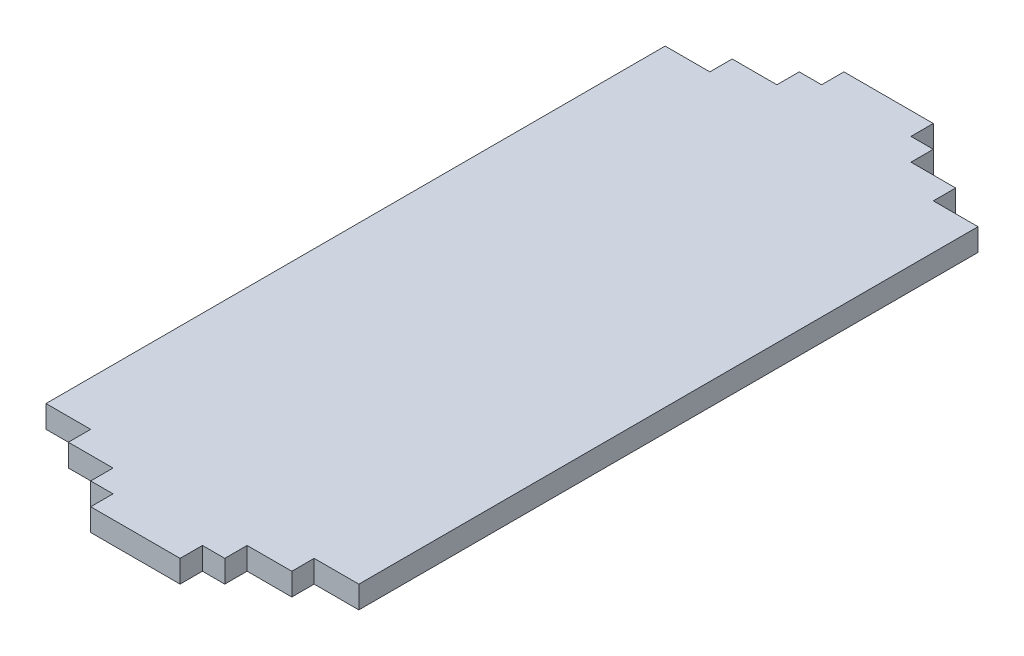
ISO-10303-21;
HEADER;
FILE_DESCRIPTION(('STEP AP214'),'2;1');
FILE_NAME('part.step','',(''),(''),'','','');
FILE_SCHEMA(('AUTOMOTIVE_DESIGN { 1 0 10303 214 1 1 1 1 }'));
ENDSEC;
DATA;
#1=APPLICATION_CONTEXT('core data for automotive mechanical design processes');
#2=APPLICATION_PROTOCOL_DEFINITION('international standard','automotive_design',2000,#1);
#3=PRODUCT_CONTEXT('',#1,'mechanical');
#4=PRODUCT('Part','Part','',(#3));
#5=PRODUCT_RELATED_PRODUCT_CATEGORY('part','',(#4));
#6=PRODUCT_DEFINITION_FORMATION('','',#4);
#7=PRODUCT_DEFINITION_CONTEXT('part definition',#1,'design');
#8=PRODUCT_DEFINITION('design','',#6,#7);
#9=PRODUCT_DEFINITION_SHAPE('','',#8);
#10=(LENGTH_UNIT() NAMED_UNIT(*) SI_UNIT(.MILLI.,.METRE.));
#11=(NAMED_UNIT(*) PLANE_ANGLE_UNIT() SI_UNIT($,.RADIAN.));
#12=(NAMED_UNIT(*) SI_UNIT($,.STERADIAN.) SOLID_ANGLE_UNIT());
#13=UNCERTAINTY_MEASURE_WITH_UNIT(LENGTH_MEASURE(1.E-05),#10,'distance_accuracy_value','');
#14=(GEOMETRIC_REPRESENTATION_CONTEXT(3) GLOBAL_UNCERTAINTY_ASSIGNED_CONTEXT((#13)) GLOBAL_UNIT_ASSIGNED_CONTEXT((#10,
#11,#12)) REPRESENTATION_CONTEXT('',''));
#15=CARTESIAN_POINT('',(0.,0.,0.));
#16=DIRECTION('',(0.,0.,1.));
#17=DIRECTION('',(1.,0.,0.));
#18=AXIS2_PLACEMENT_3D('',#15,#16,#17);
#19=CARTESIAN_POINT('',(-228.412737342942,36.0517266461979,-107.022511378717));
#20=DIRECTION('',(-1.,0.,0.));
#21=DIRECTION('',(0.,0.,1.));
#22=AXIS2_PLACEMENT_3D('',#19,#20,#21);
#23=PLANE('',#22);
#24=DIRECTION('',(0.,1.,0.));
#25=VECTOR('',#24,1.);
#26=CARTESIAN_POINT('',(-228.412737342942,32.8767266461979,-9.52500000000346));
#27=LINE('',#26,#25);
#28=CARTESIAN_POINT('',(-228.412737342942,32.8767266461979,-9.52500000000346));
#29=VERTEX_POINT('',#28);
#30=CARTESIAN_POINT('',(-228.412737342942,36.0517266461979,-9.52500000000346));
#31=VERTEX_POINT('',#30);
#32=EDGE_CURVE('E343',#29,#31,#27,.T.);
#33=ORIENTED_EDGE('',*,*,#32,.T.);
#34=DIRECTION('',(0.,0.,1.));
#35=VECTOR('',#34,1.);
#36=CARTESIAN_POINT('',(-228.412737342942,36.0517266461979,-107.022511378717));
#37=LINE('',#36,#35);
#38=CARTESIAN_POINT('',(-228.412737342942,36.0517266461979,-97.4975113786815));
#39=VERTEX_POINT('',#38);
#40=EDGE_CURVE('E11',#39,#31,#37,.T.);
#41=ORIENTED_EDGE('',*,*,#40,.F.);
#42=DIRECTION('',(0.,1.,0.));
#43=VECTOR('',#42,1.);
#44=CARTESIAN_POINT('',(-228.412737342942,32.8767266461979,-97.4975113786815));
#45=LINE('',#44,#43);
#46=CARTESIAN_POINT('',(-228.412737342942,32.8767266461979,-97.4975113786815));
#47=VERTEX_POINT('',#46);
#48=EDGE_CURVE('E262',#47,#39,#45,.T.);
#49=ORIENTED_EDGE('',*,*,#48,.F.);
#50=DIRECTION('',(0.,0.,1.));
#51=VECTOR('',#50,1.);
#52=CARTESIAN_POINT('',(-228.412737342942,32.8767266461979,-107.022511378717));
#53=LINE('',#52,#51);
#54=EDGE_CURVE('E36',#47,#29,#53,.T.);
#55=ORIENTED_EDGE('',*,*,#54,.T.);
#56=EDGE_LOOP('',(#33,#41,#49,#55));
#57=FACE_BOUND('',#56,.T.);
#58=ADVANCED_FACE('F33',(#57),#23,.T.);
#59=CARTESIAN_POINT('',(-228.412737342942,36.0517266461979,-107.022511378717));
#60=DIRECTION('',(0.,-1.,0.));
#61=DIRECTION('',(0.,0.,-1.));
#62=AXIS2_PLACEMENT_3D('',#59,#60,#61);
#63=PLANE('',#62);
#64=DIRECTION('',(1.,0.,0.));
#65=VECTOR('',#64,1.);
#66=CARTESIAN_POINT('',(-228.412737342942,36.0517266461979,0.));
#67=LINE('',#66,#65);
#68=CARTESIAN_POINT('',(-212.537737342942,36.0517266461979,0.));
#69=VERTEX_POINT('',#68);
#70=CARTESIAN_POINT('',(-199.837737342942,36.0517266461979,0.));
#71=VERTEX_POINT('',#70);
#72=EDGE_CURVE('E250',#69,#71,#67,.T.);
#73=ORIENTED_EDGE('',*,*,#72,.T.);
#74=DIRECTION('',(0.,0.,1.));
#75=VECTOR('',#74,1.);
#76=CARTESIAN_POINT('',(-199.837737342942,36.0517266461979,0.));
#77=LINE('',#76,#75);
#78=CARTESIAN_POINT('',(-199.837737342942,36.0517266461979,-3.17500000000412));
#79=VERTEX_POINT('',#78);
#80=EDGE_CURVE('E49',#79,#71,#77,.T.);
#81=ORIENTED_EDGE('',*,*,#80,.F.);
#82=DIRECTION('',(-1.,0.,0.));
#83=VECTOR('',#82,1.);
#84=CARTESIAN_POINT('',(-196.662737342942,36.0517266461979,-3.17500000000411));
#85=LINE('',#84,#83);
#86=CARTESIAN_POINT('',(-196.662737342942,36.0517266461979,-3.17500000000411));
#87=VERTEX_POINT('',#86);
#88=EDGE_CURVE('E417',#87,#79,#85,.T.);
#89=ORIENTED_EDGE('',*,*,#88,.F.);
#90=DIRECTION('',(0.,0.,1.));
#91=VECTOR('',#90,1.);
#92=CARTESIAN_POINT('',(-196.662737342942,36.0517266461979,-3.17500000000411));
#93=LINE('',#92,#91);
#94=CARTESIAN_POINT('',(-196.662737342942,36.0517266461979,-6.3500000000043));
#95=VERTEX_POINT('',#94);
#96=EDGE_CURVE('E420',#95,#87,#93,.T.);
#97=ORIENTED_EDGE('',*,*,#96,.F.);
#98=DIRECTION('',(-1.,0.,0.));
#99=VECTOR('',#98,1.);
#100=CARTESIAN_POINT('',(-190.312737342942,36.0517266461979,-6.3500000000043));
#101=LINE('',#100,#99);
#102=CARTESIAN_POINT('',(-190.312737342942,36.0517266461979,-6.3500000000043));
#103=VERTEX_POINT('',#102);
#104=EDGE_CURVE('E423',#103,#95,#101,.T.);
#105=ORIENTED_EDGE('',*,*,#104,.F.);
#106=DIRECTION('',(0.,0.,1.));
#107=VECTOR('',#106,1.);
#108=CARTESIAN_POINT('',(-190.312737342942,36.0517266461979,-6.3500000000043));
#109=LINE('',#108,#107);
#110=CARTESIAN_POINT('',(-190.312737342942,36.0517266461979,-9.52500000000126));
#111=VERTEX_POINT('',#110);
#112=EDGE_CURVE('E426',#111,#103,#109,.T.);
#113=ORIENTED_EDGE('',*,*,#112,.F.);
#114=DIRECTION('',(-1.,0.,2.87117224134114E-13));
#115=VECTOR('',#114,1.);
#116=CARTESIAN_POINT('',(-183.962737342942,36.0517266461979,-9.52500000000308));
#117=LINE('',#116,#115);
#118=CARTESIAN_POINT('',(-183.962737342942,36.0517266461979,-9.52500000000308));
#119=VERTEX_POINT('',#118);
#120=EDGE_CURVE('E429',#119,#111,#117,.T.);
#121=ORIENTED_EDGE('',*,*,#120,.F.);
#122=DIRECTION('',(0.,0.,1.));
#123=VECTOR('',#122,1.);
#124=CARTESIAN_POINT('',(-183.962737342942,36.0517266461979,-107.022511378717));
#125=LINE('',#124,#123);
#126=CARTESIAN_POINT('',(-183.962737342942,36.0517266461979,-97.4975113786815));
#127=VERTEX_POINT('',#126);
#128=EDGE_CURVE('E41',#127,#119,#125,.T.);
#129=ORIENTED_EDGE('',*,*,#128,.F.);
#130=DIRECTION('',(1.,0.,0.));
#131=VECTOR('',#130,1.);
#132=CARTESIAN_POINT('',(-183.962737342942,36.0517266461979,-97.4975113786815));
#133=LINE('',#132,#131);
#134=CARTESIAN_POINT('',(-190.312737342942,36.0517266461979,-97.4975113786815));
#135=VERTEX_POINT('',#134);
#136=EDGE_CURVE('E325',#135,#127,#133,.T.);
#137=ORIENTED_EDGE('',*,*,#136,.F.);
#138=DIRECTION('',(0.,0.,1.));
#139=VECTOR('',#138,1.);
#140=CARTESIAN_POINT('',(-190.312737342942,36.0517266461979,-100.672511378681));
#141=LINE('',#140,#139);
#142=CARTESIAN_POINT('',(-190.312737342942,36.0517266461979,-100.672511378681));
#143=VERTEX_POINT('',#142);
#144=EDGE_CURVE('E328',#143,#135,#141,.T.);
#145=ORIENTED_EDGE('',*,*,#144,.F.);
#146=DIRECTION('',(1.,0.,0.));
#147=VECTOR('',#146,1.);
#148=CARTESIAN_POINT('',(-190.312737342942,36.0517266461979,-100.672511378681));
#149=LINE('',#148,#147);
#150=CARTESIAN_POINT('',(-196.662737342942,36.0517266461979,-100.672511378681));
#151=VERTEX_POINT('',#150);
#152=EDGE_CURVE('E331',#151,#143,#149,.T.);
#153=ORIENTED_EDGE('',*,*,#152,.F.);
#154=DIRECTION('',(0.,0.,1.));
#155=VECTOR('',#154,1.);
#156=CARTESIAN_POINT('',(-196.662737342942,36.0517266461979,-103.847511378682));
#157=LINE('',#156,#155);
#158=CARTESIAN_POINT('',(-196.662737342942,36.0517266461979,-103.847511378682));
#159=VERTEX_POINT('',#158);
#160=EDGE_CURVE('E334',#159,#151,#157,.T.);
#161=ORIENTED_EDGE('',*,*,#160,.F.);
#162=DIRECTION('',(1.,0.,0.));
#163=VECTOR('',#162,1.);
#164=CARTESIAN_POINT('',(-196.662737342942,36.0517266461979,-103.847511378682));
#165=LINE('',#164,#163);
#166=CARTESIAN_POINT('',(-199.837737342942,36.0517266461979,-103.847511378682));
#167=VERTEX_POINT('',#166);
#168=EDGE_CURVE('E337',#167,#159,#165,.T.);
#169=ORIENTED_EDGE('',*,*,#168,.F.);
#170=DIRECTION('',(0.,0.,1.));
#171=VECTOR('',#170,1.);
#172=CARTESIAN_POINT('',(-199.837737342942,36.0517266461979,-107.022511378717));
#173=LINE('',#172,#171);
#174=CARTESIAN_POINT('',(-199.837737342942,36.0517266461979,-107.022511378717));
#175=VERTEX_POINT('',#174);
#176=EDGE_CURVE('E340',#175,#167,#173,.T.);
#177=ORIENTED_EDGE('',*,*,#176,.F.);
#178=DIRECTION('',(1.,0.,0.));
#179=VECTOR('',#178,1.);
#180=CARTESIAN_POINT('',(-228.412737342942,36.0517266461979,-107.022511378717));
#181=LINE('',#180,#179);
#182=CARTESIAN_POINT('',(-212.537737342942,36.0517266461979,-107.022511378717));
#183=VERTEX_POINT('',#182);
#184=EDGE_CURVE('E248',#183,#175,#181,.T.);
#185=ORIENTED_EDGE('',*,*,#184,.F.);
#186=DIRECTION('',(0.,0.,-1.));
#187=VECTOR('',#186,1.);
#188=CARTESIAN_POINT('',(-212.537737342942,36.0517266461979,-107.022511378717));
#189=LINE('',#188,#187);
#190=CARTESIAN_POINT('',(-212.537737342942,36.0517266461979,-103.847511378682));
#191=VERTEX_POINT('',#190);
#192=EDGE_CURVE('E277',#191,#183,#189,.T.);
#193=ORIENTED_EDGE('',*,*,#192,.F.);
#194=DIRECTION('',(1.,0.,0.));
#195=VECTOR('',#194,1.);
#196=CARTESIAN_POINT('',(-215.712737342942,36.0517266461979,-103.847511378682));
#197=LINE('',#196,#195);
#198=CARTESIAN_POINT('',(-215.712737342942,36.0517266461979,-103.847511378682));
#199=VERTEX_POINT('',#198);
#200=EDGE_CURVE('E280',#199,#191,#197,.T.);
#201=ORIENTED_EDGE('',*,*,#200,.F.);
#202=DIRECTION('',(0.,0.,-1.));
#203=VECTOR('',#202,1.);
#204=CARTESIAN_POINT('',(-215.712737342942,36.0517266461979,-103.847511378682));
#205=LINE('',#204,#203);
#206=CARTESIAN_POINT('',(-215.712737342942,36.0517266461979,-100.672511378681));
#207=VERTEX_POINT('',#206);
#208=EDGE_CURVE('E283',#207,#199,#205,.T.);
#209=ORIENTED_EDGE('',*,*,#208,.F.);
#210=DIRECTION('',(1.,0.,0.));
#211=VECTOR('',#210,1.);
#212=CARTESIAN_POINT('',(-222.062737342942,36.0517266461979,-100.672511378681));
#213=LINE('',#212,#211);
#214=CARTESIAN_POINT('',(-222.062737342942,36.0517266461979,-100.672511378681));
#215=VERTEX_POINT('',#214);
#216=EDGE_CURVE('E286',#215,#207,#213,.T.);
#217=ORIENTED_EDGE('',*,*,#216,.F.);
#218=DIRECTION('',(0.,0.,-1.));
#219=VECTOR('',#218,1.);
#220=CARTESIAN_POINT('',(-222.062737342942,36.0517266461979,-100.672511378681));
#221=LINE('',#220,#219);
#222=CARTESIAN_POINT('',(-222.062737342942,36.0517266461979,-97.4975113786815));
#223=VERTEX_POINT('',#222);
#224=EDGE_CURVE('E289',#223,#215,#221,.T.);
#225=ORIENTED_EDGE('',*,*,#224,.F.);
#226=DIRECTION('',(1.,0.,0.));
#227=VECTOR('',#226,1.);
#228=CARTESIAN_POINT('',(-228.412737342942,36.0517266461979,-97.4975113786815));
#229=LINE('',#228,#227);
#230=EDGE_CURVE('E292',#39,#223,#229,.T.);
#231=ORIENTED_EDGE('',*,*,#230,.F.);
#232=ORIENTED_EDGE('',*,*,#40,.T.);
#233=DIRECTION('',(-1.,0.,-3.47491064794095E-13));
#234=VECTOR('',#233,1.);
#235=CARTESIAN_POINT('',(-228.412737342942,36.0517266461979,-9.52500000000346));
#236=LINE('',#235,#234);
#237=CARTESIAN_POINT('',(-222.062737342942,36.0517266461979,-9.52500000000126));
#238=VERTEX_POINT('',#237);
#239=EDGE_CURVE('E373',#238,#31,#236,.T.);
#240=ORIENTED_EDGE('',*,*,#239,.F.);
#241=DIRECTION('',(0.,0.,-1.));
#242=VECTOR('',#241,1.);
#243=CARTESIAN_POINT('',(-222.062737342942,36.0517266461979,-6.3500000000043));
#244=LINE('',#243,#242);
#245=CARTESIAN_POINT('',(-222.062737342942,36.0517266461979,-6.3500000000043));
#246=VERTEX_POINT('',#245);
#247=EDGE_CURVE('E375',#246,#238,#244,.T.);
#248=ORIENTED_EDGE('',*,*,#247,.F.);
#249=DIRECTION('',(-1.,0.,0.));
#250=VECTOR('',#249,1.);
#251=CARTESIAN_POINT('',(-222.062737342942,36.0517266461979,-6.3500000000043));
#252=LINE('',#251,#250);
#253=CARTESIAN_POINT('',(-215.712737342942,36.0517266461979,-6.3500000000043));
#254=VERTEX_POINT('',#253);
#255=EDGE_CURVE('E378',#254,#246,#252,.T.);
#256=ORIENTED_EDGE('',*,*,#255,.F.);
#257=DIRECTION('',(0.,0.,-1.));
#258=VECTOR('',#257,1.);
#259=CARTESIAN_POINT('',(-215.712737342942,36.0517266461979,-3.17500000000411));
#260=LINE('',#259,#258);
#261=CARTESIAN_POINT('',(-215.712737342942,36.0517266461979,-3.17500000000411));
#262=VERTEX_POINT('',#261);
#263=EDGE_CURVE('E381',#262,#254,#260,.T.);
#264=ORIENTED_EDGE('',*,*,#263,.F.);
#265=DIRECTION('',(-1.,0.,0.));
#266=VECTOR('',#265,1.);
#267=CARTESIAN_POINT('',(-215.712737342942,36.0517266461979,-3.17500000000411));
#268=LINE('',#267,#266);
#269=CARTESIAN_POINT('',(-212.537737342942,36.0517266461979,-3.17500000000411));
#270=VERTEX_POINT('',#269);
#271=EDGE_CURVE('E384',#270,#262,#268,.T.);
#272=ORIENTED_EDGE('',*,*,#271,.F.);
#273=DIRECTION('',(0.,0.,-1.));
#274=VECTOR('',#273,1.);
#275=CARTESIAN_POINT('',(-212.537737342942,36.0517266461979,0.));
#276=LINE('',#275,#274);
#277=EDGE_CURVE('E387',#69,#270,#276,.T.);
#278=ORIENTED_EDGE('',*,*,#277,.F.);
#279=EDGE_LOOP('',(#73,#81,#89,#97,#105,#113,#121,#129,#137,#145,#153,#161,#169,#177,#185,#193,
#201,#209,#217,#225,#231,#232,#240,#248,#256,#264,#272,#278));
#280=FACE_BOUND('',#279,.T.);
#281=ADVANCED_FACE('F464',(#280),#63,.F.);
#282=CARTESIAN_POINT('',(-183.962737342942,36.0517266461979,-107.022511378717));
#283=DIRECTION('',(-1.,0.,0.));
#284=DIRECTION('',(0.,0.,1.));
#285=AXIS2_PLACEMENT_3D('',#282,#283,#284);
#286=PLANE('',#285);
#287=ORIENTED_EDGE('',*,*,#128,.T.);
#288=DIRECTION('',(0.,1.,0.));
#289=VECTOR('',#288,1.);
#290=CARTESIAN_POINT('',(-183.962737342942,32.8767266461979,-9.52500000000308));
#291=LINE('',#290,#289);
#292=CARTESIAN_POINT('',(-183.962737342942,32.8767266461979,-9.52500000000308));
#293=VERTEX_POINT('',#292);
#294=EDGE_CURVE('E222',#293,#119,#291,.T.);
#295=ORIENTED_EDGE('',*,*,#294,.F.);
#296=DIRECTION('',(0.,0.,1.));
#297=VECTOR('',#296,1.);
#298=CARTESIAN_POINT('',(-183.962737342942,32.8767266461979,-107.022511378717));
#299=LINE('',#298,#297);
#300=CARTESIAN_POINT('',(-183.962737342942,32.8767266461979,-97.4975113786815));
#301=VERTEX_POINT('',#300);
#302=EDGE_CURVE('E236',#301,#293,#299,.T.);
#303=ORIENTED_EDGE('',*,*,#302,.F.);
#304=DIRECTION('',(0.,1.,0.));
#305=VECTOR('',#304,1.);
#306=CARTESIAN_POINT('',(-183.962737342942,32.8767266461979,-97.4975113786815));
#307=LINE('',#306,#305);
#308=EDGE_CURVE('E295',#301,#127,#307,.T.);
#309=ORIENTED_EDGE('',*,*,#308,.T.);
#310=EDGE_LOOP('',(#287,#295,#303,#309));
#311=FACE_BOUND('',#310,.T.);
#312=ADVANCED_FACE('F234',(#311),#286,.F.);
#313=CARTESIAN_POINT('',(-228.412737342942,32.8767266461979,-107.022511378717));
#314=DIRECTION('',(0.,-1.,0.));
#315=DIRECTION('',(0.,0.,-1.));
#316=AXIS2_PLACEMENT_3D('',#313,#314,#315);
#317=PLANE('',#316);
#318=DIRECTION('',(0.,0.,1.));
#319=VECTOR('',#318,1.);
#320=CARTESIAN_POINT('',(-199.837737342942,32.8767266461979,0.));
#321=LINE('',#320,#319);
#322=CARTESIAN_POINT('',(-199.837737342942,32.8767266461979,-3.17500000000412));
#323=VERTEX_POINT('',#322);
#324=CARTESIAN_POINT('',(-199.837737342942,32.8767266461979,0.));
#325=VERTEX_POINT('',#324);
#326=EDGE_CURVE('E238',#323,#325,#321,.T.);
#327=ORIENTED_EDGE('',*,*,#326,.T.);
#328=DIRECTION('',(1.,0.,0.));
#329=VECTOR('',#328,1.);
#330=CARTESIAN_POINT('',(-228.412737342942,32.8767266461979,0.));
#331=LINE('',#330,#329);
#332=CARTESIAN_POINT('',(-212.537737342942,32.8767266461979,0.));
#333=VERTEX_POINT('',#332);
#334=EDGE_CURVE('E254',#333,#325,#331,.T.);
#335=ORIENTED_EDGE('',*,*,#334,.F.);
#336=DIRECTION('',(0.,0.,-1.));
#337=VECTOR('',#336,1.);
#338=CARTESIAN_POINT('',(-212.537737342942,32.8767266461979,0.));
#339=LINE('',#338,#337);
#340=CARTESIAN_POINT('',(-212.537737342942,32.8767266461979,-3.17500000000411));
#341=VERTEX_POINT('',#340);
#342=EDGE_CURVE('E57',#333,#341,#339,.T.);
#343=ORIENTED_EDGE('',*,*,#342,.T.);
#344=DIRECTION('',(-1.,0.,0.));
#345=VECTOR('',#344,1.);
#346=CARTESIAN_POINT('',(-215.712737342942,32.8767266461979,-3.17500000000411));
#347=LINE('',#346,#345);
#348=CARTESIAN_POINT('',(-215.712737342942,32.8767266461979,-3.17500000000411));
#349=VERTEX_POINT('',#348);
#350=EDGE_CURVE('E402',#341,#349,#347,.T.);
#351=ORIENTED_EDGE('',*,*,#350,.T.);
#352=DIRECTION('',(0.,0.,-1.));
#353=VECTOR('',#352,1.);
#354=CARTESIAN_POINT('',(-215.712737342942,32.8767266461979,-3.17500000000411));
#355=LINE('',#354,#353);
#356=CARTESIAN_POINT('',(-215.712737342942,32.8767266461979,-6.3500000000043));
#357=VERTEX_POINT('',#356);
#358=EDGE_CURVE('E399',#349,#357,#355,.T.);
#359=ORIENTED_EDGE('',*,*,#358,.T.);
#360=DIRECTION('',(-1.,0.,0.));
#361=VECTOR('',#360,1.);
#362=CARTESIAN_POINT('',(-222.062737342942,32.8767266461979,-6.3500000000043));
#363=LINE('',#362,#361);
#364=CARTESIAN_POINT('',(-222.062737342942,32.8767266461979,-6.3500000000043));
#365=VERTEX_POINT('',#364);
#366=EDGE_CURVE('E396',#357,#365,#363,.T.);
#367=ORIENTED_EDGE('',*,*,#366,.T.);
#368=DIRECTION('',(0.,0.,-1.));
#369=VECTOR('',#368,1.);
#370=CARTESIAN_POINT('',(-222.062737342942,32.8767266461979,-6.3500000000043));
#371=LINE('',#370,#369);
#372=CARTESIAN_POINT('',(-222.062737342942,32.8767266461979,-9.52500000000126));
#373=VERTEX_POINT('',#372);
#374=EDGE_CURVE('E393',#365,#373,#371,.T.);
#375=ORIENTED_EDGE('',*,*,#374,.T.);
#376=DIRECTION('',(-1.,0.,-3.47491064794095E-13));
#377=VECTOR('',#376,1.);
#378=CARTESIAN_POINT('',(-228.412737342942,32.8767266461979,-9.52500000000346));
#379=LINE('',#378,#377);
#380=EDGE_CURVE('E361',#373,#29,#379,.T.);
#381=ORIENTED_EDGE('',*,*,#380,.T.);
#382=ORIENTED_EDGE('',*,*,#54,.F.);
#383=DIRECTION('',(1.,0.,0.));
#384=VECTOR('',#383,1.);
#385=CARTESIAN_POINT('',(-228.412737342942,32.8767266461979,-97.4975113786815));
#386=LINE('',#385,#384);
#387=CARTESIAN_POINT('',(-222.062737342942,32.8767266461979,-97.4975113786815));
#388=VERTEX_POINT('',#387);
#389=EDGE_CURVE('E279',#47,#388,#386,.T.);
#390=ORIENTED_EDGE('',*,*,#389,.T.);
#391=DIRECTION('',(0.,0.,-1.));
#392=VECTOR('',#391,1.);
#393=CARTESIAN_POINT('',(-222.062737342942,32.8767266461979,-100.672511378681));
#394=LINE('',#393,#392);
#395=CARTESIAN_POINT('',(-222.062737342942,32.8767266461979,-100.672511378681));
#396=VERTEX_POINT('',#395);
#397=EDGE_CURVE('E307',#388,#396,#394,.T.);
#398=ORIENTED_EDGE('',*,*,#397,.T.);
#399=DIRECTION('',(1.,0.,0.));
#400=VECTOR('',#399,1.);
#401=CARTESIAN_POINT('',(-222.062737342942,32.8767266461979,-100.672511378681));
#402=LINE('',#401,#400);
#403=CARTESIAN_POINT('',(-215.712737342942,32.8767266461979,-100.672511378681));
#404=VERTEX_POINT('',#403);
#405=EDGE_CURVE('E304',#396,#404,#402,.T.);
#406=ORIENTED_EDGE('',*,*,#405,.T.);
#407=DIRECTION('',(0.,0.,-1.));
#408=VECTOR('',#407,1.);
#409=CARTESIAN_POINT('',(-215.712737342942,32.8767266461979,-103.847511378682));
#410=LINE('',#409,#408);
#411=CARTESIAN_POINT('',(-215.712737342942,32.8767266461979,-103.847511378682));
#412=VERTEX_POINT('',#411);
#413=EDGE_CURVE('E301',#404,#412,#410,.T.);
#414=ORIENTED_EDGE('',*,*,#413,.T.);
#415=DIRECTION('',(1.,0.,0.));
#416=VECTOR('',#415,1.);
#417=CARTESIAN_POINT('',(-215.712737342942,32.8767266461979,-103.847511378682));
#418=LINE('',#417,#416);
#419=CARTESIAN_POINT('',(-212.537737342942,32.8767266461979,-103.847511378682));
#420=VERTEX_POINT('',#419);
#421=EDGE_CURVE('E298',#412,#420,#418,.T.);
#422=ORIENTED_EDGE('',*,*,#421,.T.);
#423=DIRECTION('',(0.,0.,-1.));
#424=VECTOR('',#423,1.);
#425=CARTESIAN_POINT('',(-212.537737342942,32.8767266461979,-107.022511378717));
#426=LINE('',#425,#424);
#427=CARTESIAN_POINT('',(-212.537737342942,32.8767266461979,-107.022511378717));
#428=VERTEX_POINT('',#427);
#429=EDGE_CURVE('E265',#420,#428,#426,.T.);
#430=ORIENTED_EDGE('',*,*,#429,.T.);
#431=DIRECTION('',(1.,0.,0.));
#432=VECTOR('',#431,1.);
#433=CARTESIAN_POINT('',(-228.412737342942,32.8767266461979,-107.022511378717));
#434=LINE('',#433,#432);
#435=CARTESIAN_POINT('',(-199.837737342942,32.8767266461979,-107.022511378717));
#436=VERTEX_POINT('',#435);
#437=EDGE_CURVE('E253',#428,#436,#434,.T.);
#438=ORIENTED_EDGE('',*,*,#437,.T.);
#439=DIRECTION('',(0.,0.,1.));
#440=VECTOR('',#439,1.);
#441=CARTESIAN_POINT('',(-199.837737342942,32.8767266461979,-107.022511378717));
#442=LINE('',#441,#440);
#443=CARTESIAN_POINT('',(-199.837737342942,32.8767266461979,-103.847511378682));
#444=VERTEX_POINT('',#443);
#445=EDGE_CURVE('E327',#436,#444,#442,.T.);
#446=ORIENTED_EDGE('',*,*,#445,.T.);
#447=DIRECTION('',(1.,0.,0.));
#448=VECTOR('',#447,1.);
#449=CARTESIAN_POINT('',(-196.662737342942,32.8767266461979,-103.847511378682));
#450=LINE('',#449,#448);
#451=CARTESIAN_POINT('',(-196.662737342942,32.8767266461979,-103.847511378682));
#452=VERTEX_POINT('',#451);
#453=EDGE_CURVE('E353',#444,#452,#450,.T.);
#454=ORIENTED_EDGE('',*,*,#453,.T.);
#455=DIRECTION('',(0.,0.,1.));
#456=VECTOR('',#455,1.);
#457=CARTESIAN_POINT('',(-196.662737342942,32.8767266461979,-103.847511378682));
#458=LINE('',#457,#456);
#459=CARTESIAN_POINT('',(-196.662737342942,32.8767266461979,-100.672511378681));
#460=VERTEX_POINT('',#459);
#461=EDGE_CURVE('E350',#452,#460,#458,.T.);
#462=ORIENTED_EDGE('',*,*,#461,.T.);
#463=DIRECTION('',(1.,0.,0.));
#464=VECTOR('',#463,1.);
#465=CARTESIAN_POINT('',(-190.312737342942,32.8767266461979,-100.672511378681));
#466=LINE('',#465,#464);
#467=CARTESIAN_POINT('',(-190.312737342942,32.8767266461979,-100.672511378681));
#468=VERTEX_POINT('',#467);
#469=EDGE_CURVE('E347',#460,#468,#466,.T.);
#470=ORIENTED_EDGE('',*,*,#469,.T.);
#471=DIRECTION('',(0.,0.,1.));
#472=VECTOR('',#471,1.);
#473=CARTESIAN_POINT('',(-190.312737342942,32.8767266461979,-100.672511378681));
#474=LINE('',#473,#472);
#475=CARTESIAN_POINT('',(-190.312737342942,32.8767266461979,-97.4975113786815));
#476=VERTEX_POINT('',#475);
#477=EDGE_CURVE('E345',#468,#476,#474,.T.);
#478=ORIENTED_EDGE('',*,*,#477,.T.);
#479=DIRECTION('',(1.,0.,0.));
#480=VECTOR('',#479,1.);
#481=CARTESIAN_POINT('',(-183.962737342942,32.8767266461979,-97.4975113786815));
#482=LINE('',#481,#480);
#483=EDGE_CURVE('E245',#476,#301,#482,.T.);
#484=ORIENTED_EDGE('',*,*,#483,.T.);
#485=ORIENTED_EDGE('',*,*,#302,.T.);
#486=DIRECTION('',(-1.,0.,2.87117224134114E-13));
#487=VECTOR('',#486,1.);
#488=CARTESIAN_POINT('',(-183.962737342942,32.8767266461979,-9.52500000000308));
#489=LINE('',#488,#487);
#490=CARTESIAN_POINT('',(-190.312737342942,32.8767266461979,-9.52500000000126));
#491=VERTEX_POINT('',#490);
#492=EDGE_CURVE('E218',#293,#491,#489,.T.);
#493=ORIENTED_EDGE('',*,*,#492,.T.);
#494=DIRECTION('',(0.,0.,1.));
#495=VECTOR('',#494,1.);
#496=CARTESIAN_POINT('',(-190.312737342942,32.8767266461979,-6.3500000000043));
#497=LINE('',#496,#495);
#498=CARTESIAN_POINT('',(-190.312737342942,32.8767266461979,-6.3500000000043));
#499=VERTEX_POINT('',#498);
#500=EDGE_CURVE('E229',#491,#499,#497,.T.);
#501=ORIENTED_EDGE('',*,*,#500,.T.);
#502=DIRECTION('',(-1.,0.,0.));
#503=VECTOR('',#502,1.);
#504=CARTESIAN_POINT('',(-190.312737342942,32.8767266461979,-6.3500000000043));
#505=LINE('',#504,#503);
#506=CARTESIAN_POINT('',(-196.662737342942,32.8767266461979,-6.3500000000043));
#507=VERTEX_POINT('',#506);
#508=EDGE_CURVE('E438',#499,#507,#505,.T.);
#509=ORIENTED_EDGE('',*,*,#508,.T.);
#510=DIRECTION('',(0.,0.,1.));
#511=VECTOR('',#510,1.);
#512=CARTESIAN_POINT('',(-196.662737342942,32.8767266461979,-3.17500000000411));
#513=LINE('',#512,#511);
#514=CARTESIAN_POINT('',(-196.662737342942,32.8767266461979,-3.17500000000411));
#515=VERTEX_POINT('',#514);
#516=EDGE_CURVE('E435',#507,#515,#513,.T.);
#517=ORIENTED_EDGE('',*,*,#516,.T.);
#518=DIRECTION('',(-1.,0.,0.));
#519=VECTOR('',#518,1.);
#520=CARTESIAN_POINT('',(-196.662737342942,32.8767266461979,-3.17500000000411));
#521=LINE('',#520,#519);
#522=EDGE_CURVE('E432',#515,#323,#521,.T.);
#523=ORIENTED_EDGE('',*,*,#522,.T.);
#524=EDGE_LOOP('',(#327,#335,#343,#351,#359,#367,#375,#381,#382,#390,#398,#406,#414,#422,#430,
#438,#446,#454,#462,#470,#478,#484,#485,#493,#501,#509,#517,#523));
#525=FACE_BOUND('',#524,.T.);
#526=ADVANCED_FACE('F242',(#525),#317,.T.);
#527=CARTESIAN_POINT('',(0.,0.,-107.022511378717));
#528=DIRECTION('',(0.,0.,1.));
#529=DIRECTION('',(1.,0.,0.));
#530=AXIS2_PLACEMENT_3D('',#527,#528,#529);
#531=PLANE('',#530);
#532=ORIENTED_EDGE('',*,*,#184,.T.);
#533=DIRECTION('',(0.,1.,0.));
#534=VECTOR('',#533,1.);
#535=CARTESIAN_POINT('',(-199.837737342942,32.8767266461979,-107.022511378717));
#536=LINE('',#535,#534);
#537=EDGE_CURVE('E312',#436,#175,#536,.T.);
#538=ORIENTED_EDGE('',*,*,#537,.F.);
#539=ORIENTED_EDGE('',*,*,#437,.F.);
#540=DIRECTION('',(0.,1.,0.));
#541=VECTOR('',#540,1.);
#542=CARTESIAN_POINT('',(-212.537737342942,32.8767266461979,-107.022511378717));
#543=LINE('',#542,#541);
#544=EDGE_CURVE('E257',#428,#183,#543,.T.);
#545=ORIENTED_EDGE('',*,*,#544,.T.);
#546=EDGE_LOOP('',(#532,#538,#539,#545));
#547=FACE_BOUND('',#546,.T.);
#548=ADVANCED_FACE('F516',(#547),#531,.F.);
#549=CARTESIAN_POINT('',(0.,0.,0.));
#550=DIRECTION('',(0.,0.,1.));
#551=DIRECTION('',(1.,0.,0.));
#552=AXIS2_PLACEMENT_3D('',#549,#550,#551);
#553=PLANE('',#552);
#554=DIRECTION('',(0.,1.,0.));
#555=VECTOR('',#554,1.);
#556=CARTESIAN_POINT('',(-199.837737342942,32.8767266461979,0.));
#557=LINE('',#556,#555);
#558=EDGE_CURVE('E390',#325,#71,#557,.T.);
#559=ORIENTED_EDGE('',*,*,#558,.T.);
#560=ORIENTED_EDGE('',*,*,#72,.F.);
#561=DIRECTION('',(0.,1.,0.));
#562=VECTOR('',#561,1.);
#563=CARTESIAN_POINT('',(-212.537737342942,32.8767266461979,0.));
#564=LINE('',#563,#562);
#565=EDGE_CURVE('E358',#333,#69,#564,.T.);
#566=ORIENTED_EDGE('',*,*,#565,.F.);
#567=ORIENTED_EDGE('',*,*,#334,.T.);
#568=EDGE_LOOP('',(#559,#560,#566,#567));
#569=FACE_BOUND('',#568,.T.);
#570=ADVANCED_FACE('F461',(#569),#553,.T.);
#571=CARTESIAN_POINT('',(-212.537737342942,32.8767266461979,-107.022511378717));
#572=DIRECTION('',(1.,0.,0.));
#573=DIRECTION('',(0.,0.,-1.));
#574=AXIS2_PLACEMENT_3D('',#571,#572,#573);
#575=PLANE('',#574);
#576=ORIENTED_EDGE('',*,*,#192,.T.);
#577=ORIENTED_EDGE('',*,*,#544,.F.);
#578=ORIENTED_EDGE('',*,*,#429,.F.);
#579=DIRECTION('',(0.,1.,0.));
#580=VECTOR('',#579,1.);
#581=CARTESIAN_POINT('',(-212.537737342942,32.8767266461979,-103.847511378682));
#582=LINE('',#581,#580);
#583=EDGE_CURVE('E273',#420,#191,#582,.T.);
#584=ORIENTED_EDGE('',*,*,#583,.T.);
#585=EDGE_LOOP('',(#576,#577,#578,#584));
#586=FACE_BOUND('',#585,.T.);
#587=ADVANCED_FACE('F513',(#586),#575,.F.);
#588=CARTESIAN_POINT('',(-215.712737342942,32.8767266461979,-103.847511378682));
#589=DIRECTION('',(0.,0.,1.));
#590=DIRECTION('',(1.,0.,0.));
#591=AXIS2_PLACEMENT_3D('',#588,#589,#590);
#592=PLANE('',#591);
#593=ORIENTED_EDGE('',*,*,#200,.T.);
#594=ORIENTED_EDGE('',*,*,#583,.F.);
#595=ORIENTED_EDGE('',*,*,#421,.F.);
#596=DIRECTION('',(0.,1.,0.));
#597=VECTOR('',#596,1.);
#598=CARTESIAN_POINT('',(-215.712737342942,32.8767266461979,-103.847511378682));
#599=LINE('',#598,#597);
#600=EDGE_CURVE('E271',#412,#199,#599,.T.);
#601=ORIENTED_EDGE('',*,*,#600,.T.);
#602=EDGE_LOOP('',(#593,#594,#595,#601));
#603=FACE_BOUND('',#602,.T.);
#604=ADVANCED_FACE('F509',(#603),#592,.F.);
#605=CARTESIAN_POINT('',(-215.712737342942,32.8767266461979,-103.847511378682));
#606=DIRECTION('',(1.,0.,0.));
#607=DIRECTION('',(0.,0.,-1.));
#608=AXIS2_PLACEMENT_3D('',#605,#606,#607);
#609=PLANE('',#608);
#610=ORIENTED_EDGE('',*,*,#208,.T.);
#611=ORIENTED_EDGE('',*,*,#600,.F.);
#612=ORIENTED_EDGE('',*,*,#413,.F.);
#613=DIRECTION('',(0.,1.,0.));
#614=VECTOR('',#613,1.);
#615=CARTESIAN_POINT('',(-215.712737342942,32.8767266461979,-100.672511378681));
#616=LINE('',#615,#614);
#617=EDGE_CURVE('E269',#404,#207,#616,.T.);
#618=ORIENTED_EDGE('',*,*,#617,.T.);
#619=EDGE_LOOP('',(#610,#611,#612,#618));
#620=FACE_BOUND('',#619,.T.);
#621=ADVANCED_FACE('F504',(#620),#609,.F.);
#622=CARTESIAN_POINT('',(-222.062737342942,32.8767266461979,-100.672511378681));
#623=DIRECTION('',(0.,0.,1.));
#624=DIRECTION('',(1.,0.,0.));
#625=AXIS2_PLACEMENT_3D('',#622,#623,#624);
#626=PLANE('',#625);
#627=ORIENTED_EDGE('',*,*,#216,.T.);
#628=ORIENTED_EDGE('',*,*,#617,.F.);
#629=ORIENTED_EDGE('',*,*,#405,.F.);
#630=DIRECTION('',(0.,1.,0.));
#631=VECTOR('',#630,1.);
#632=CARTESIAN_POINT('',(-222.062737342942,32.8767266461979,-100.672511378681));
#633=LINE('',#632,#631);
#634=EDGE_CURVE('E267',#396,#215,#633,.T.);
#635=ORIENTED_EDGE('',*,*,#634,.T.);
#636=EDGE_LOOP('',(#627,#628,#629,#635));
#637=FACE_BOUND('',#636,.T.);
#638=ADVANCED_FACE('F500',(#637),#626,.F.);
#639=CARTESIAN_POINT('',(-222.062737342942,32.8767266461979,-100.672511378681));
#640=DIRECTION('',(1.,0.,0.));
#641=DIRECTION('',(0.,0.,-1.));
#642=AXIS2_PLACEMENT_3D('',#639,#640,#641);
#643=PLANE('',#642);
#644=ORIENTED_EDGE('',*,*,#224,.T.);
#645=ORIENTED_EDGE('',*,*,#634,.F.);
#646=ORIENTED_EDGE('',*,*,#397,.F.);
#647=DIRECTION('',(0.,1.,0.));
#648=VECTOR('',#647,1.);
#649=CARTESIAN_POINT('',(-222.062737342942,32.8767266461979,-97.4975113786815));
#650=LINE('',#649,#648);
#651=EDGE_CURVE('E264',#388,#223,#650,.T.);
#652=ORIENTED_EDGE('',*,*,#651,.T.);
#653=EDGE_LOOP('',(#644,#645,#646,#652));
#654=FACE_BOUND('',#653,.T.);
#655=ADVANCED_FACE('F498',(#654),#643,.F.);
#656=CARTESIAN_POINT('',(-228.412737342942,32.8767266461979,-97.4975113786815));
#657=DIRECTION('',(0.,0.,1.));
#658=DIRECTION('',(1.,0.,0.));
#659=AXIS2_PLACEMENT_3D('',#656,#657,#658);
#660=PLANE('',#659);
#661=ORIENTED_EDGE('',*,*,#230,.T.);
#662=ORIENTED_EDGE('',*,*,#651,.F.);
#663=ORIENTED_EDGE('',*,*,#389,.F.);
#664=ORIENTED_EDGE('',*,*,#48,.T.);
#665=EDGE_LOOP('',(#661,#662,#663,#664));
#666=FACE_BOUND('',#665,.T.);
#667=ADVANCED_FACE('F494',(#666),#660,.F.);
#668=CARTESIAN_POINT('',(-183.962737342942,32.8767266461979,-97.4975113786815));
#669=DIRECTION('',(0.,0.,1.));
#670=DIRECTION('',(1.,0.,0.));
#671=AXIS2_PLACEMENT_3D('',#668,#669,#670);
#672=PLANE('',#671);
#673=ORIENTED_EDGE('',*,*,#136,.T.);
#674=ORIENTED_EDGE('',*,*,#308,.F.);
#675=ORIENTED_EDGE('',*,*,#483,.F.);
#676=DIRECTION('',(0.,1.,0.));
#677=VECTOR('',#676,1.);
#678=CARTESIAN_POINT('',(-190.312737342942,32.8767266461979,-97.4975113786815));
#679=LINE('',#678,#677);
#680=EDGE_CURVE('E322',#476,#135,#679,.T.);
#681=ORIENTED_EDGE('',*,*,#680,.T.);
#682=EDGE_LOOP('',(#673,#674,#675,#681));
#683=FACE_BOUND('',#682,.T.);
#684=ADVANCED_FACE('F539',(#683),#672,.F.);
#685=CARTESIAN_POINT('',(-190.312737342942,32.8767266461979,-100.672511378681));
#686=DIRECTION('',(-1.,0.,0.));
#687=DIRECTION('',(0.,0.,1.));
#688=AXIS2_PLACEMENT_3D('',#685,#686,#687);
#689=PLANE('',#688);
#690=ORIENTED_EDGE('',*,*,#144,.T.);
#691=ORIENTED_EDGE('',*,*,#680,.F.);
#692=ORIENTED_EDGE('',*,*,#477,.F.);
#693=DIRECTION('',(0.,1.,0.));
#694=VECTOR('',#693,1.);
#695=CARTESIAN_POINT('',(-190.312737342942,32.8767266461979,-100.672511378681));
#696=LINE('',#695,#694);
#697=EDGE_CURVE('E320',#468,#143,#696,.T.);
#698=ORIENTED_EDGE('',*,*,#697,.T.);
#699=EDGE_LOOP('',(#690,#691,#692,#698));
#700=FACE_BOUND('',#699,.T.);
#701=ADVANCED_FACE('F535',(#700),#689,.F.);
#702=CARTESIAN_POINT('',(-190.312737342942,32.8767266461979,-100.672511378681));
#703=DIRECTION('',(0.,0.,1.));
#704=DIRECTION('',(1.,0.,0.));
#705=AXIS2_PLACEMENT_3D('',#702,#703,#704);
#706=PLANE('',#705);
#707=ORIENTED_EDGE('',*,*,#152,.T.);
#708=ORIENTED_EDGE('',*,*,#697,.F.);
#709=ORIENTED_EDGE('',*,*,#469,.F.);
#710=DIRECTION('',(0.,1.,0.));
#711=VECTOR('',#710,1.);
#712=CARTESIAN_POINT('',(-196.662737342942,32.8767266461979,-100.672511378681));
#713=LINE('',#712,#711);
#714=EDGE_CURVE('E318',#460,#151,#713,.T.);
#715=ORIENTED_EDGE('',*,*,#714,.T.);
#716=EDGE_LOOP('',(#707,#708,#709,#715));
#717=FACE_BOUND('',#716,.T.);
#718=ADVANCED_FACE('F532',(#717),#706,.F.);
#719=CARTESIAN_POINT('',(-196.662737342942,32.8767266461979,-103.847511378682));
#720=DIRECTION('',(-1.,0.,0.));
#721=DIRECTION('',(0.,0.,1.));
#722=AXIS2_PLACEMENT_3D('',#719,#720,#721);
#723=PLANE('',#722);
#724=ORIENTED_EDGE('',*,*,#160,.T.);
#725=ORIENTED_EDGE('',*,*,#714,.F.);
#726=ORIENTED_EDGE('',*,*,#461,.F.);
#727=DIRECTION('',(0.,1.,0.));
#728=VECTOR('',#727,1.);
#729=CARTESIAN_POINT('',(-196.662737342942,32.8767266461979,-103.847511378682));
#730=LINE('',#729,#728);
#731=EDGE_CURVE('E316',#452,#159,#730,.T.);
#732=ORIENTED_EDGE('',*,*,#731,.T.);
#733=EDGE_LOOP('',(#724,#725,#726,#732));
#734=FACE_BOUND('',#733,.T.);
#735=ADVANCED_FACE('F528',(#734),#723,.F.);
#736=CARTESIAN_POINT('',(-196.662737342942,32.8767266461979,-103.847511378682));
#737=DIRECTION('',(0.,0.,1.));
#738=DIRECTION('',(1.,0.,0.));
#739=AXIS2_PLACEMENT_3D('',#736,#737,#738);
#740=PLANE('',#739);
#741=ORIENTED_EDGE('',*,*,#168,.T.);
#742=ORIENTED_EDGE('',*,*,#731,.F.);
#743=ORIENTED_EDGE('',*,*,#453,.F.);
#744=DIRECTION('',(0.,1.,0.));
#745=VECTOR('',#744,1.);
#746=CARTESIAN_POINT('',(-199.837737342942,32.8767266461979,-103.847511378682));
#747=LINE('',#746,#745);
#748=EDGE_CURVE('E314',#444,#167,#747,.T.);
#749=ORIENTED_EDGE('',*,*,#748,.T.);
#750=EDGE_LOOP('',(#741,#742,#743,#749));
#751=FACE_BOUND('',#750,.T.);
#752=ADVANCED_FACE('F526',(#751),#740,.F.);
#753=CARTESIAN_POINT('',(-199.837737342942,32.8767266461979,-107.022511378717));
#754=DIRECTION('',(-1.,0.,0.));
#755=DIRECTION('',(0.,0.,1.));
#756=AXIS2_PLACEMENT_3D('',#753,#754,#755);
#757=PLANE('',#756);
#758=ORIENTED_EDGE('',*,*,#176,.T.);
#759=ORIENTED_EDGE('',*,*,#748,.F.);
#760=ORIENTED_EDGE('',*,*,#445,.F.);
#761=ORIENTED_EDGE('',*,*,#537,.T.);
#762=EDGE_LOOP('',(#758,#759,#760,#761));
#763=FACE_BOUND('',#762,.T.);
#764=ADVANCED_FACE('F522',(#763),#757,.F.);
#765=CARTESIAN_POINT('',(-228.412737342942,32.8767266461979,-9.52500000000346));
#766=DIRECTION('',(3.47491064794095E-13,0.,-1.));
#767=DIRECTION('',(-1.,0.,-3.47491064794095E-13));
#768=AXIS2_PLACEMENT_3D('',#765,#766,#767);
#769=PLANE('',#768);
#770=ORIENTED_EDGE('',*,*,#239,.T.);
#771=ORIENTED_EDGE('',*,*,#32,.F.);
#772=ORIENTED_EDGE('',*,*,#380,.F.);
#773=DIRECTION('',(0.,1.,0.));
#774=VECTOR('',#773,1.);
#775=CARTESIAN_POINT('',(-222.062737342942,32.8767266461979,-9.52500000000126));
#776=LINE('',#775,#774);
#777=EDGE_CURVE('E369',#373,#238,#776,.T.);
#778=ORIENTED_EDGE('',*,*,#777,.T.);
#779=EDGE_LOOP('',(#770,#771,#772,#778));
#780=FACE_BOUND('',#779,.T.);
#781=ADVANCED_FACE('F486',(#780),#769,.F.);
#782=CARTESIAN_POINT('',(-222.062737342942,32.8767266461979,-6.3500000000043));
#783=DIRECTION('',(1.,0.,0.));
#784=DIRECTION('',(0.,0.,-1.));
#785=AXIS2_PLACEMENT_3D('',#782,#783,#784);
#786=PLANE('',#785);
#787=ORIENTED_EDGE('',*,*,#247,.T.);
#788=ORIENTED_EDGE('',*,*,#777,.F.);
#789=ORIENTED_EDGE('',*,*,#374,.F.);
#790=DIRECTION('',(0.,1.,0.));
#791=VECTOR('',#790,1.);
#792=CARTESIAN_POINT('',(-222.062737342942,32.8767266461979,-6.3500000000043));
#793=LINE('',#792,#791);
#794=EDGE_CURVE('E367',#365,#246,#793,.T.);
#795=ORIENTED_EDGE('',*,*,#794,.T.);
#796=EDGE_LOOP('',(#787,#788,#789,#795));
#797=FACE_BOUND('',#796,.T.);
#798=ADVANCED_FACE('F482',(#797),#786,.F.);
#799=CARTESIAN_POINT('',(-222.062737342942,32.8767266461979,-6.3500000000043));
#800=DIRECTION('',(0.,0.,-1.));
#801=DIRECTION('',(-1.,0.,0.));
#802=AXIS2_PLACEMENT_3D('',#799,#800,#801);
#803=PLANE('',#802);
#804=ORIENTED_EDGE('',*,*,#255,.T.);
#805=ORIENTED_EDGE('',*,*,#794,.F.);
#806=ORIENTED_EDGE('',*,*,#366,.F.);
#807=DIRECTION('',(0.,1.,0.));
#808=VECTOR('',#807,1.);
#809=CARTESIAN_POINT('',(-215.712737342942,32.8767266461979,-6.3500000000043));
#810=LINE('',#809,#808);
#811=EDGE_CURVE('E365',#357,#254,#810,.T.);
#812=ORIENTED_EDGE('',*,*,#811,.T.);
#813=EDGE_LOOP('',(#804,#805,#806,#812));
#814=FACE_BOUND('',#813,.T.);
#815=ADVANCED_FACE('F477',(#814),#803,.F.);
#816=CARTESIAN_POINT('',(-215.712737342942,32.8767266461979,-3.17500000000411));
#817=DIRECTION('',(1.,0.,0.));
#818=DIRECTION('',(0.,0.,-1.));
#819=AXIS2_PLACEMENT_3D('',#816,#817,#818);
#820=PLANE('',#819);
#821=ORIENTED_EDGE('',*,*,#263,.T.);
#822=ORIENTED_EDGE('',*,*,#811,.F.);
#823=ORIENTED_EDGE('',*,*,#358,.F.);
#824=DIRECTION('',(0.,1.,0.));
#825=VECTOR('',#824,1.);
#826=CARTESIAN_POINT('',(-215.712737342942,32.8767266461979,-3.17500000000411));
#827=LINE('',#826,#825);
#828=EDGE_CURVE('E363',#349,#262,#827,.T.);
#829=ORIENTED_EDGE('',*,*,#828,.T.);
#830=EDGE_LOOP('',(#821,#822,#823,#829));
#831=FACE_BOUND('',#830,.T.);
#832=ADVANCED_FACE('F473',(#831),#820,.F.);
#833=CARTESIAN_POINT('',(-215.712737342942,32.8767266461979,-3.17500000000411));
#834=DIRECTION('',(0.,0.,-1.));
#835=DIRECTION('',(-1.,0.,0.));
#836=AXIS2_PLACEMENT_3D('',#833,#834,#835);
#837=PLANE('',#836);
#838=ORIENTED_EDGE('',*,*,#271,.T.);
#839=ORIENTED_EDGE('',*,*,#828,.F.);
#840=ORIENTED_EDGE('',*,*,#350,.F.);
#841=DIRECTION('',(0.,1.,0.));
#842=VECTOR('',#841,1.);
#843=CARTESIAN_POINT('',(-212.537737342942,32.8767266461979,-3.17500000000411));
#844=LINE('',#843,#842);
#845=EDGE_CURVE('E360',#341,#270,#844,.T.);
#846=ORIENTED_EDGE('',*,*,#845,.T.);
#847=EDGE_LOOP('',(#838,#839,#840,#846));
#848=FACE_BOUND('',#847,.T.);
#849=ADVANCED_FACE('F471',(#848),#837,.F.);
#850=CARTESIAN_POINT('',(-212.537737342942,32.8767266461979,0.));
#851=DIRECTION('',(1.,0.,0.));
#852=DIRECTION('',(0.,0.,-1.));
#853=AXIS2_PLACEMENT_3D('',#850,#851,#852);
#854=PLANE('',#853);
#855=ORIENTED_EDGE('',*,*,#277,.T.);
#856=ORIENTED_EDGE('',*,*,#845,.F.);
#857=ORIENTED_EDGE('',*,*,#342,.F.);
#858=ORIENTED_EDGE('',*,*,#565,.T.);
#859=EDGE_LOOP('',(#855,#856,#857,#858));
#860=FACE_BOUND('',#859,.T.);
#861=ADVANCED_FACE('F467',(#860),#854,.F.);
#862=CARTESIAN_POINT('',(-199.837737342942,32.8767266461979,0.));
#863=DIRECTION('',(-1.,0.,0.));
#864=DIRECTION('',(0.,0.,1.));
#865=AXIS2_PLACEMENT_3D('',#862,#863,#864);
#866=PLANE('',#865);
#867=ORIENTED_EDGE('',*,*,#80,.T.);
#868=ORIENTED_EDGE('',*,*,#558,.F.);
#869=ORIENTED_EDGE('',*,*,#326,.F.);
#870=DIRECTION('',(0.,1.,0.));
#871=VECTOR('',#870,1.);
#872=CARTESIAN_POINT('',(-199.837737342942,32.8767266461979,-3.17500000000412));
#873=LINE('',#872,#871);
#874=EDGE_CURVE('E413',#323,#79,#873,.T.);
#875=ORIENTED_EDGE('',*,*,#874,.T.);
#876=EDGE_LOOP('',(#867,#868,#869,#875));
#877=FACE_BOUND('',#876,.T.);
#878=ADVANCED_FACE('F458',(#877),#866,.F.);
#879=CARTESIAN_POINT('',(-196.662737342942,32.8767266461979,-3.17500000000411));
#880=DIRECTION('',(0.,0.,-1.));
#881=DIRECTION('',(-1.,0.,0.));
#882=AXIS2_PLACEMENT_3D('',#879,#880,#881);
#883=PLANE('',#882);
#884=ORIENTED_EDGE('',*,*,#88,.T.);
#885=ORIENTED_EDGE('',*,*,#874,.F.);
#886=ORIENTED_EDGE('',*,*,#522,.F.);
#887=DIRECTION('',(0.,1.,0.));
#888=VECTOR('',#887,1.);
#889=CARTESIAN_POINT('',(-196.662737342942,32.8767266461979,-3.17500000000411));
#890=LINE('',#889,#888);
#891=EDGE_CURVE('E411',#515,#87,#890,.T.);
#892=ORIENTED_EDGE('',*,*,#891,.T.);
#893=EDGE_LOOP('',(#884,#885,#886,#892));
#894=FACE_BOUND('',#893,.T.);
#895=ADVANCED_FACE('F456',(#894),#883,.F.);
#896=CARTESIAN_POINT('',(-196.662737342942,32.8767266461979,-3.17500000000411));
#897=DIRECTION('',(-1.,0.,0.));
#898=DIRECTION('',(0.,0.,1.));
#899=AXIS2_PLACEMENT_3D('',#896,#897,#898);
#900=PLANE('',#899);
#901=ORIENTED_EDGE('',*,*,#96,.T.);
#902=ORIENTED_EDGE('',*,*,#891,.F.);
#903=ORIENTED_EDGE('',*,*,#516,.F.);
#904=DIRECTION('',(0.,1.,0.));
#905=VECTOR('',#904,1.);
#906=CARTESIAN_POINT('',(-196.662737342942,32.8767266461979,-6.3500000000043));
#907=LINE('',#906,#905);
#908=EDGE_CURVE('E409',#507,#95,#907,.T.);
#909=ORIENTED_EDGE('',*,*,#908,.T.);
#910=EDGE_LOOP('',(#901,#902,#903,#909));
#911=FACE_BOUND('',#910,.T.);
#912=ADVANCED_FACE('F451',(#911),#900,.F.);
#913=CARTESIAN_POINT('',(-190.312737342942,32.8767266461979,-6.3500000000043));
#914=DIRECTION('',(0.,0.,-1.));
#915=DIRECTION('',(-1.,0.,0.));
#916=AXIS2_PLACEMENT_3D('',#913,#914,#915);
#917=PLANE('',#916);
#918=ORIENTED_EDGE('',*,*,#104,.T.);
#919=ORIENTED_EDGE('',*,*,#908,.F.);
#920=ORIENTED_EDGE('',*,*,#508,.F.);
#921=DIRECTION('',(0.,1.,0.));
#922=VECTOR('',#921,1.);
#923=CARTESIAN_POINT('',(-190.312737342942,32.8767266461979,-6.3500000000043));
#924=LINE('',#923,#922);
#925=EDGE_CURVE('E407',#499,#103,#924,.T.);
#926=ORIENTED_EDGE('',*,*,#925,.T.);
#927=EDGE_LOOP('',(#918,#919,#920,#926));
#928=FACE_BOUND('',#927,.T.);
#929=ADVANCED_FACE('F447',(#928),#917,.F.);
#930=CARTESIAN_POINT('',(-190.312737342942,32.8767266461979,-6.3500000000043));
#931=DIRECTION('',(-1.,0.,0.));
#932=DIRECTION('',(0.,0.,1.));
#933=AXIS2_PLACEMENT_3D('',#930,#931,#932);
#934=PLANE('',#933);
#935=ORIENTED_EDGE('',*,*,#112,.T.);
#936=ORIENTED_EDGE('',*,*,#925,.F.);
#937=ORIENTED_EDGE('',*,*,#500,.F.);
#938=DIRECTION('',(0.,1.,0.));
#939=VECTOR('',#938,1.);
#940=CARTESIAN_POINT('',(-190.312737342942,32.8767266461979,-9.52500000000126));
#941=LINE('',#940,#939);
#942=EDGE_CURVE('E224',#491,#111,#941,.T.);
#943=ORIENTED_EDGE('',*,*,#942,.T.);
#944=EDGE_LOOP('',(#935,#936,#937,#943));
#945=FACE_BOUND('',#944,.T.);
#946=ADVANCED_FACE('F443',(#945),#934,.F.);
#947=CARTESIAN_POINT('',(-183.962737342942,32.8767266461979,-9.52500000000308));
#948=DIRECTION('',(-2.87117224134114E-13,0.,-1.));
#949=DIRECTION('',(-1.,0.,2.87117224134114E-13));
#950=AXIS2_PLACEMENT_3D('',#947,#948,#949);
#951=PLANE('',#950);
#952=ORIENTED_EDGE('',*,*,#120,.T.);
#953=ORIENTED_EDGE('',*,*,#942,.F.);
#954=ORIENTED_EDGE('',*,*,#492,.F.);
#955=ORIENTED_EDGE('',*,*,#294,.T.);
#956=EDGE_LOOP('',(#952,#953,#954,#955));
#957=FACE_BOUND('',#956,.T.);
#958=ADVANCED_FACE('F221',(#957),#951,.F.);
#959=CLOSED_SHELL('',(#58,#281,#312,#526,#548,#570,#587,#604,#621,#638,#655,#667,#684,#701,#718,
#735,#752,#764,#781,#798,#815,#832,#849,#861,#878,#895,#912,#929,#946,#958));
#960=MANIFOLD_SOLID_BREP('B2',#959);
#961=ADVANCED_BREP_SHAPE_REPRESENTATION('',(#18,#960),#14);
#962=SHAPE_DEFINITION_REPRESENTATION(#9,#961);
ENDSEC;
END-ISO-10303-21;
